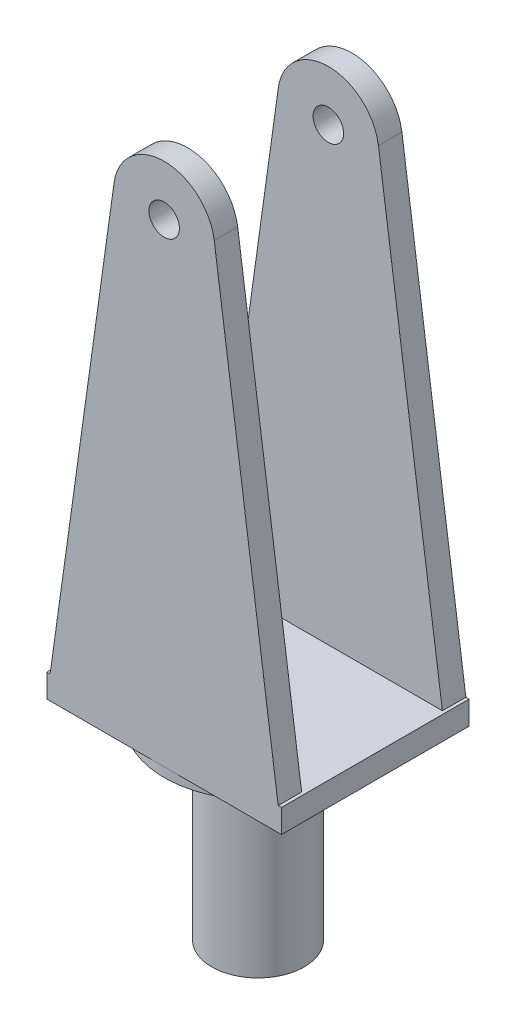
ISO-10303-21;
HEADER;
FILE_DESCRIPTION(('STEP AP214'),'2;1');
FILE_NAME('part.step','',(''),(''),'','','');
FILE_SCHEMA(('AUTOMOTIVE_DESIGN { 1 0 10303 214 1 1 1 1 }'));
ENDSEC;
DATA;
#1=APPLICATION_CONTEXT('core data for automotive mechanical design processes');
#2=APPLICATION_PROTOCOL_DEFINITION('international standard','automotive_design',2000,#1);
#3=PRODUCT_CONTEXT('',#1,'mechanical');
#4=PRODUCT('Part','Part','',(#3));
#5=PRODUCT_RELATED_PRODUCT_CATEGORY('part','',(#4));
#6=PRODUCT_DEFINITION_FORMATION('','',#4);
#7=PRODUCT_DEFINITION_CONTEXT('part definition',#1,'design');
#8=PRODUCT_DEFINITION('design','',#6,#7);
#9=PRODUCT_DEFINITION_SHAPE('','',#8);
#10=(LENGTH_UNIT() NAMED_UNIT(*) SI_UNIT(.MILLI.,.METRE.));
#11=(NAMED_UNIT(*) PLANE_ANGLE_UNIT() SI_UNIT($,.RADIAN.));
#12=(NAMED_UNIT(*) SI_UNIT($,.STERADIAN.) SOLID_ANGLE_UNIT());
#13=UNCERTAINTY_MEASURE_WITH_UNIT(LENGTH_MEASURE(1.E-05),#10,'distance_accuracy_value','');
#14=(GEOMETRIC_REPRESENTATION_CONTEXT(3) GLOBAL_UNCERTAINTY_ASSIGNED_CONTEXT((#13)) GLOBAL_UNIT_ASSIGNED_CONTEXT((#10,
#11,#12)) REPRESENTATION_CONTEXT('',''));
#15=CARTESIAN_POINT('',(0.,0.,0.));
#16=DIRECTION('',(0.,0.,1.));
#17=DIRECTION('',(1.,0.,0.));
#18=AXIS2_PLACEMENT_3D('',#15,#16,#17);
#19=CARTESIAN_POINT('',(0.,2.5,0.));
#20=DIRECTION('',(0.,-1.,0.));
#21=DIRECTION('',(0.,0.,-1.));
#22=AXIS2_PLACEMENT_3D('',#19,#20,#21);
#23=PLANE('',#22);
#24=DIRECTION('',(0.,0.,1.));
#25=VECTOR('',#24,1.);
#26=CARTESIAN_POINT('',(-12.1504525190039,2.5,7.5));
#27=LINE('',#26,#25);
#28=CARTESIAN_POINT('',(-12.1504525190039,2.5,7.5));
#29=VERTEX_POINT('',#28);
#30=CARTESIAN_POINT('',(-12.1504525190039,2.5,10.));
#31=VERTEX_POINT('',#30);
#32=EDGE_CURVE('E59',#29,#31,#27,.T.);
#33=ORIENTED_EDGE('',*,*,#32,.F.);
#34=DIRECTION('',(1.,0.,0.));
#35=VECTOR('',#34,1.);
#36=CARTESIAN_POINT('',(0.,2.5,7.5));
#37=LINE('',#36,#35);
#38=CARTESIAN_POINT('',(12.1504525190039,2.5,7.5));
#39=VERTEX_POINT('',#38);
#40=EDGE_CURVE('E64',#29,#39,#37,.T.);
#41=ORIENTED_EDGE('',*,*,#40,.T.);
#42=DIRECTION('',(0.,0.,1.));
#43=VECTOR('',#42,1.);
#44=CARTESIAN_POINT('',(12.1504525190039,2.5,7.5));
#45=LINE('',#44,#43);
#46=CARTESIAN_POINT('',(12.1504525190039,2.5,10.));
#47=VERTEX_POINT('',#46);
#48=EDGE_CURVE('E159',#39,#47,#45,.T.);
#49=ORIENTED_EDGE('',*,*,#48,.T.);
#50=DIRECTION('',(1.,0.,0.));
#51=VECTOR('',#50,1.);
#52=CARTESIAN_POINT('',(-12.5,2.5,10.));
#53=LINE('',#52,#51);
#54=CARTESIAN_POINT('',(12.5,2.5,10.));
#55=VERTEX_POINT('',#54);
#56=EDGE_CURVE('E263',#47,#55,#53,.T.);
#57=ORIENTED_EDGE('',*,*,#56,.T.);
#58=DIRECTION('',(0.,0.,-1.));
#59=VECTOR('',#58,1.);
#60=CARTESIAN_POINT('',(12.5,2.5,10.));
#61=LINE('',#60,#59);
#62=CARTESIAN_POINT('',(12.5,2.5,-10.));
#63=VERTEX_POINT('',#62);
#64=EDGE_CURVE('E250',#55,#63,#61,.T.);
#65=ORIENTED_EDGE('',*,*,#64,.T.);
#66=DIRECTION('',(-1.,0.,0.));
#67=VECTOR('',#66,1.);
#68=CARTESIAN_POINT('',(-12.5,2.5,-10.));
#69=LINE('',#68,#67);
#70=CARTESIAN_POINT('',(12.1504525190039,2.5,-10.));
#71=VERTEX_POINT('',#70);
#72=EDGE_CURVE('E256',#63,#71,#69,.T.);
#73=ORIENTED_EDGE('',*,*,#72,.T.);
#74=DIRECTION('',(0.,0.,-1.));
#75=VECTOR('',#74,1.);
#76=CARTESIAN_POINT('',(12.1504525190039,2.5,-7.5));
#77=LINE('',#76,#75);
#78=CARTESIAN_POINT('',(12.1504525190039,2.5,-7.5));
#79=VERTEX_POINT('',#78);
#80=EDGE_CURVE('E229',#79,#71,#77,.T.);
#81=ORIENTED_EDGE('',*,*,#80,.F.);
#82=DIRECTION('',(1.,0.,0.));
#83=VECTOR('',#82,1.);
#84=CARTESIAN_POINT('',(0.,2.5,-7.5));
#85=LINE('',#84,#83);
#86=CARTESIAN_POINT('',(-12.1504525190039,2.5,-7.5));
#87=VERTEX_POINT('',#86);
#88=EDGE_CURVE('E205',#87,#79,#85,.T.);
#89=ORIENTED_EDGE('',*,*,#88,.F.);
#90=DIRECTION('',(0.,0.,-1.));
#91=VECTOR('',#90,1.);
#92=CARTESIAN_POINT('',(-12.1504525190039,2.5,-7.5));
#93=LINE('',#92,#91);
#94=CARTESIAN_POINT('',(-12.1504525190039,2.5,-10.));
#95=VERTEX_POINT('',#94);
#96=EDGE_CURVE('E224',#87,#95,#93,.T.);
#97=ORIENTED_EDGE('',*,*,#96,.T.);
#98=CARTESIAN_POINT('',(-12.5,2.5,-10.));
#99=VERTEX_POINT('',#98);
#100=EDGE_CURVE('E254',#95,#99,#69,.T.);
#101=ORIENTED_EDGE('',*,*,#100,.T.);
#102=DIRECTION('',(0.,0.,1.));
#103=VECTOR('',#102,1.);
#104=CARTESIAN_POINT('',(-12.5,2.5,10.));
#105=LINE('',#104,#103);
#106=CARTESIAN_POINT('',(-12.5,2.5,10.));
#107=VERTEX_POINT('',#106);
#108=EDGE_CURVE('E260',#99,#107,#105,.T.);
#109=ORIENTED_EDGE('',*,*,#108,.T.);
#110=EDGE_CURVE('E264',#107,#31,#53,.T.);
#111=ORIENTED_EDGE('',*,*,#110,.T.);
#112=EDGE_LOOP('',(#33,#41,#49,#57,#65,#73,#81,#89,#97,#101,#109,#111));
#113=FACE_BOUND('',#112,.T.);
#114=ADVANCED_FACE('F41',(#113),#23,.F.);
#115=CARTESIAN_POINT('',(0.,0.,0.));
#116=DIRECTION('',(0.,-1.,0.));
#117=DIRECTION('',(0.,0.,-1.));
#118=AXIS2_PLACEMENT_3D('',#115,#116,#117);
#119=PLANE('',#118);
#120=CARTESIAN_POINT('',(0.,0.,0.));
#121=DIRECTION('',(0.,-1.,0.));
#122=DIRECTION('',(0.,0.,-1.));
#123=AXIS2_PLACEMENT_3D('',#120,#121,#122);
#124=CIRCLE('',#123,10.);
#125=CARTESIAN_POINT('',(0.,0.,-10.));
#126=VERTEX_POINT('',#125);
#127=CARTESIAN_POINT('',(0.,0.,10.));
#128=VERTEX_POINT('',#127);
#129=EDGE_CURVE('E240',#126,#128,#124,.T.);
#130=ORIENTED_EDGE('',*,*,#129,.F.);
#131=DIRECTION('',(-1.,0.,0.));
#132=VECTOR('',#131,1.);
#133=CARTESIAN_POINT('',(-12.5,0.,-10.));
#134=LINE('',#133,#132);
#135=CARTESIAN_POINT('',(12.5,0.,-10.));
#136=VERTEX_POINT('',#135);
#137=EDGE_CURVE('E272',#136,#126,#134,.T.);
#138=ORIENTED_EDGE('',*,*,#137,.F.);
#139=DIRECTION('',(0.,0.,-1.));
#140=VECTOR('',#139,1.);
#141=CARTESIAN_POINT('',(12.5,0.,10.));
#142=LINE('',#141,#140);
#143=CARTESIAN_POINT('',(12.5,0.,10.));
#144=VERTEX_POINT('',#143);
#145=EDGE_CURVE('E246',#144,#136,#142,.T.);
#146=ORIENTED_EDGE('',*,*,#145,.F.);
#147=DIRECTION('',(1.,0.,0.));
#148=VECTOR('',#147,1.);
#149=CARTESIAN_POINT('',(-12.5,0.,10.));
#150=LINE('',#149,#148);
#151=EDGE_CURVE('E278',#128,#144,#150,.T.);
#152=ORIENTED_EDGE('',*,*,#151,.F.);
#153=EDGE_LOOP('',(#130,#138,#146,#152));
#154=FACE_BOUND('',#153,.T.);
#155=ADVANCED_FACE('F311',(#154),#119,.T.);
#156=CARTESIAN_POINT('',(12.5,2.5,10.));
#157=DIRECTION('',(-1.,0.,0.));
#158=DIRECTION('',(0.,0.,1.));
#159=AXIS2_PLACEMENT_3D('',#156,#157,#158);
#160=PLANE('',#159);
#161=ORIENTED_EDGE('',*,*,#145,.T.);
#162=DIRECTION('',(0.,-1.,0.));
#163=VECTOR('',#162,1.);
#164=CARTESIAN_POINT('',(12.5,2.5,-10.));
#165=LINE('',#164,#163);
#166=EDGE_CURVE('E45',#63,#136,#165,.T.);
#167=ORIENTED_EDGE('',*,*,#166,.F.);
#168=ORIENTED_EDGE('',*,*,#64,.F.);
#169=DIRECTION('',(0.,-1.,0.));
#170=VECTOR('',#169,1.);
#171=CARTESIAN_POINT('',(12.5,2.5,10.));
#172=LINE('',#171,#170);
#173=EDGE_CURVE('E267',#55,#144,#172,.T.);
#174=ORIENTED_EDGE('',*,*,#173,.T.);
#175=EDGE_LOOP('',(#161,#167,#168,#174));
#176=FACE_BOUND('',#175,.T.);
#177=ADVANCED_FACE('F43',(#176),#160,.F.);
#178=CARTESIAN_POINT('',(-12.5,2.5,-10.));
#179=DIRECTION('',(0.,0.,1.));
#180=DIRECTION('',(1.,0.,0.));
#181=AXIS2_PLACEMENT_3D('',#178,#179,#180);
#182=PLANE('',#181);
#183=ORIENTED_EDGE('',*,*,#137,.T.);
#184=CARTESIAN_POINT('',(-12.5,0.,-10.));
#185=VERTEX_POINT('',#184);
#186=EDGE_CURVE('E271',#126,#185,#134,.T.);
#187=ORIENTED_EDGE('',*,*,#186,.T.);
#188=DIRECTION('',(0.,-1.,0.));
#189=VECTOR('',#188,1.);
#190=CARTESIAN_POINT('',(-12.5,2.5,-10.));
#191=LINE('',#190,#189);
#192=EDGE_CURVE('E288',#99,#185,#191,.T.);
#193=ORIENTED_EDGE('',*,*,#192,.F.);
#194=ORIENTED_EDGE('',*,*,#100,.F.);
#195=DIRECTION('',(0.138472024541617,0.990366345560745,0.));
#196=VECTOR('',#195,1.);
#197=CARTESIAN_POINT('',(-12.2603187302418,1.71422541134599,-10.));
#198=LINE('',#197,#196);
#199=CARTESIAN_POINT('',(-5.33492053085576,51.245394822519,-10.));
#200=VERTEX_POINT('',#199);
#201=EDGE_CURVE('E213',#95,#200,#198,.T.);
#202=ORIENTED_EDGE('',*,*,#201,.T.);
#203=CARTESIAN_POINT('',(0.,50.5,-10.));
#204=DIRECTION('',(0.,0.,-1.));
#205=DIRECTION('',(-1.,0.,0.));
#206=AXIS2_PLACEMENT_3D('',#203,#204,#205);
#207=CIRCLE('',#206,5.38674210557592);
#208=CARTESIAN_POINT('',(5.33492053085576,51.245394822519,-10.));
#209=VERTEX_POINT('',#208);
#210=EDGE_CURVE('E217',#200,#209,#207,.T.);
#211=ORIENTED_EDGE('',*,*,#210,.T.);
#212=DIRECTION('',(-0.138472024541617,0.990366345560745,0.));
#213=VECTOR('',#212,1.);
#214=CARTESIAN_POINT('',(12.2603187302418,1.71422541134599,-10.));
#215=LINE('',#214,#213);
#216=EDGE_CURVE('E194',#71,#209,#215,.T.);
#217=ORIENTED_EDGE('',*,*,#216,.F.);
#218=ORIENTED_EDGE('',*,*,#72,.F.);
#219=ORIENTED_EDGE('',*,*,#166,.T.);
#220=EDGE_LOOP('',(#183,#187,#193,#194,#202,#211,#217,#218,#219));
#221=FACE_BOUND('',#220,.T.);
#222=CARTESIAN_POINT('',(0.,50.5,-10.));
#223=DIRECTION('',(0.,0.,-1.));
#224=DIRECTION('',(-1.,0.,0.));
#225=AXIS2_PLACEMENT_3D('',#222,#223,#224);
#226=CIRCLE('',#225,1.62700000012827);
#227=CARTESIAN_POINT('',(-1.62700000012827,50.5,-10.));
#228=VERTEX_POINT('',#227);
#229=EDGE_CURVE('E183',#228,#228,#226,.T.);
#230=ORIENTED_EDGE('',*,*,#229,.F.);
#231=EDGE_LOOP('',(#230));
#232=FACE_BOUND('',#231,.T.);
#233=ADVANCED_FACE('F324',(#221,#232),#182,.F.);
#234=CARTESIAN_POINT('',(-12.5,2.5,10.));
#235=DIRECTION('',(1.,0.,0.));
#236=DIRECTION('',(0.,0.,-1.));
#237=AXIS2_PLACEMENT_3D('',#234,#235,#236);
#238=PLANE('',#237);
#239=DIRECTION('',(0.,0.,1.));
#240=VECTOR('',#239,1.);
#241=CARTESIAN_POINT('',(-12.5,0.,10.));
#242=LINE('',#241,#240);
#243=CARTESIAN_POINT('',(-12.5,0.,10.));
#244=VERTEX_POINT('',#243);
#245=EDGE_CURVE('E275',#185,#244,#242,.T.);
#246=ORIENTED_EDGE('',*,*,#245,.T.);
#247=DIRECTION('',(0.,-1.,0.));
#248=VECTOR('',#247,1.);
#249=CARTESIAN_POINT('',(-12.5,2.5,10.));
#250=LINE('',#249,#248);
#251=EDGE_CURVE('E285',#107,#244,#250,.T.);
#252=ORIENTED_EDGE('',*,*,#251,.F.);
#253=ORIENTED_EDGE('',*,*,#108,.F.);
#254=ORIENTED_EDGE('',*,*,#192,.T.);
#255=EDGE_LOOP('',(#246,#252,#253,#254));
#256=FACE_BOUND('',#255,.T.);
#257=ADVANCED_FACE('F320',(#256),#238,.F.);
#258=CARTESIAN_POINT('',(-12.5,2.5,10.));
#259=DIRECTION('',(0.,0.,-1.));
#260=DIRECTION('',(-1.,0.,0.));
#261=AXIS2_PLACEMENT_3D('',#258,#259,#260);
#262=PLANE('',#261);
#263=EDGE_CURVE('E255',#244,#128,#150,.T.);
#264=ORIENTED_EDGE('',*,*,#263,.T.);
#265=ORIENTED_EDGE('',*,*,#151,.T.);
#266=ORIENTED_EDGE('',*,*,#173,.F.);
#267=ORIENTED_EDGE('',*,*,#56,.F.);
#268=DIRECTION('',(-0.138472024541617,0.990366345560745,0.));
#269=VECTOR('',#268,1.);
#270=CARTESIAN_POINT('',(12.2603187302418,1.71422541134599,10.));
#271=LINE('',#270,#269);
#272=CARTESIAN_POINT('',(5.33492053085576,51.245394822519,10.));
#273=VERTEX_POINT('',#272);
#274=EDGE_CURVE('E176',#47,#273,#271,.T.);
#275=ORIENTED_EDGE('',*,*,#274,.T.);
#276=CARTESIAN_POINT('',(0.,50.5,10.));
#277=DIRECTION('',(0.,0.,-1.));
#278=DIRECTION('',(-1.,0.,0.));
#279=AXIS2_PLACEMENT_3D('',#276,#277,#278);
#280=CIRCLE('',#279,5.38674210557592);
#281=CARTESIAN_POINT('',(-5.33492053085576,51.245394822519,10.));
#282=VERTEX_POINT('',#281);
#283=EDGE_CURVE('E153',#282,#273,#280,.T.);
#284=ORIENTED_EDGE('',*,*,#283,.F.);
#285=DIRECTION('',(0.138472024541617,0.990366345560745,0.));
#286=VECTOR('',#285,1.);
#287=CARTESIAN_POINT('',(-12.2603187302418,1.71422541134599,10.));
#288=LINE('',#287,#286);
#289=EDGE_CURVE('E172',#31,#282,#288,.T.);
#290=ORIENTED_EDGE('',*,*,#289,.F.);
#291=ORIENTED_EDGE('',*,*,#110,.F.);
#292=ORIENTED_EDGE('',*,*,#251,.T.);
#293=EDGE_LOOP('',(#264,#265,#266,#267,#275,#284,#290,#291,#292));
#294=FACE_BOUND('',#293,.T.);
#295=CARTESIAN_POINT('',(0.,50.5,10.));
#296=DIRECTION('',(0.,0.,-1.));
#297=DIRECTION('',(-1.,0.,0.));
#298=AXIS2_PLACEMENT_3D('',#295,#296,#297);
#299=CIRCLE('',#298,1.62700000012827);
#300=CARTESIAN_POINT('',(-1.62700000012827,50.5,10.));
#301=VERTEX_POINT('',#300);
#302=EDGE_CURVE('E168',#301,#301,#299,.T.);
#303=ORIENTED_EDGE('',*,*,#302,.T.);
#304=EDGE_LOOP('',(#303));
#305=FACE_BOUND('',#304,.T.);
#306=ADVANCED_FACE('F315',(#294,#305),#262,.F.);
#307=EDGE_CURVE('E51',#128,#126,#124,.T.);
#308=ORIENTED_EDGE('',*,*,#307,.F.);
#309=ORIENTED_EDGE('',*,*,#263,.F.);
#310=ORIENTED_EDGE('',*,*,#245,.F.);
#311=ORIENTED_EDGE('',*,*,#186,.F.);
#312=EDGE_LOOP('',(#308,#309,#310,#311));
#313=FACE_BOUND('',#312,.T.);
#314=ADVANCED_FACE('F308',(#313),#119,.T.);
#315=CARTESIAN_POINT('',(0.,-1.,0.));
#316=DIRECTION('',(0.,1.,0.));
#317=DIRECTION('',(0.,0.,1.));
#318=AXIS2_PLACEMENT_3D('',#315,#316,#317);
#319=CYLINDRICAL_SURFACE('',#318,10.);
#320=CARTESIAN_POINT('',(0.,-1.,0.));
#321=DIRECTION('',(0.,-1.,0.));
#322=DIRECTION('',(0.,0.,-1.));
#323=AXIS2_PLACEMENT_3D('',#320,#321,#322);
#324=CIRCLE('',#323,10.);
#325=CARTESIAN_POINT('',(0.,-1.,-10.));
#326=VERTEX_POINT('',#325);
#327=EDGE_CURVE('E242',#326,#326,#324,.T.);
#328=ORIENTED_EDGE('',*,*,#327,.F.);
#329=EDGE_LOOP('',(#328));
#330=FACE_BOUND('',#329,.T.);
#331=ORIENTED_EDGE('',*,*,#129,.T.);
#332=ORIENTED_EDGE('',*,*,#307,.T.);
#333=EDGE_LOOP('',(#331,#332));
#334=FACE_BOUND('',#333,.T.);
#335=ADVANCED_FACE('F302',(#330,#334),#319,.T.);
#336=CARTESIAN_POINT('',(0.,-1.,0.));
#337=DIRECTION('',(0.,-1.,0.));
#338=DIRECTION('',(0.,0.,-1.));
#339=AXIS2_PLACEMENT_3D('',#336,#337,#338);
#340=PLANE('',#339);
#341=CARTESIAN_POINT('',(0.,-1.,0.));
#342=DIRECTION('',(0.,-1.,0.));
#343=DIRECTION('',(0.,0.,-1.));
#344=AXIS2_PLACEMENT_3D('',#341,#342,#343);
#345=CIRCLE('',#344,4.9365);
#346=CARTESIAN_POINT('',(0.,-1.,-4.9365));
#347=VERTEX_POINT('',#346);
#348=EDGE_CURVE('E11',#347,#347,#345,.T.);
#349=ORIENTED_EDGE('',*,*,#348,.F.);
#350=EDGE_LOOP('',(#349));
#351=FACE_BOUND('',#350,.T.);
#352=ORIENTED_EDGE('',*,*,#327,.T.);
#353=EDGE_LOOP('',(#352));
#354=FACE_BOUND('',#353,.T.);
#355=ADVANCED_FACE('F367',(#351,#354),#340,.T.);
#356=CARTESIAN_POINT('',(0.,-21.,0.));
#357=DIRECTION('',(0.,1.,0.));
#358=DIRECTION('',(0.,0.,1.));
#359=AXIS2_PLACEMENT_3D('',#356,#357,#358);
#360=CYLINDRICAL_SURFACE('',#359,4.9365);
#361=CARTESIAN_POINT('',(0.,-21.,0.));
#362=DIRECTION('',(0.,-1.,0.));
#363=DIRECTION('',(0.,0.,-1.));
#364=AXIS2_PLACEMENT_3D('',#361,#362,#363);
#365=CIRCLE('',#364,4.9365);
#366=CARTESIAN_POINT('',(0.,-21.,-4.9365));
#367=VERTEX_POINT('',#366);
#368=EDGE_CURVE('E228',#367,#367,#365,.T.);
#369=ORIENTED_EDGE('',*,*,#368,.F.);
#370=EDGE_LOOP('',(#369));
#371=FACE_BOUND('',#370,.T.);
#372=ORIENTED_EDGE('',*,*,#348,.T.);
#373=EDGE_LOOP('',(#372));
#374=FACE_BOUND('',#373,.T.);
#375=ADVANCED_FACE('F374',(#371,#374),#360,.T.);
#376=CARTESIAN_POINT('',(0.,-21.,0.));
#377=DIRECTION('',(0.,-1.,0.));
#378=DIRECTION('',(0.,0.,-1.));
#379=AXIS2_PLACEMENT_3D('',#376,#377,#378);
#380=PLANE('',#379);
#381=ORIENTED_EDGE('',*,*,#368,.T.);
#382=EDGE_LOOP('',(#381));
#383=FACE_BOUND('',#382,.T.);
#384=ADVANCED_FACE('F381',(#383),#380,.T.);
#385=CARTESIAN_POINT('',(-12.2603187302418,1.71422541134599,-7.5));
#386=DIRECTION('',(-0.990366345560745,0.138472024541617,0.));
#387=DIRECTION('',(-0.138472024541617,-0.990366345560745,0.));
#388=AXIS2_PLACEMENT_3D('',#385,#386,#387);
#389=PLANE('',#388);
#390=ORIENTED_EDGE('',*,*,#201,.F.);
#391=ORIENTED_EDGE('',*,*,#96,.F.);
#392=DIRECTION('',(0.138472024541617,0.990366345560745,0.));
#393=VECTOR('',#392,1.);
#394=CARTESIAN_POINT('',(-12.2603187302418,1.71422541134599,-7.5));
#395=LINE('',#394,#393);
#396=CARTESIAN_POINT('',(-5.33492053085576,51.245394822519,-7.5));
#397=VERTEX_POINT('',#396);
#398=EDGE_CURVE('E193',#87,#397,#395,.T.);
#399=ORIENTED_EDGE('',*,*,#398,.T.);
#400=DIRECTION('',(0.,0.,-1.));
#401=VECTOR('',#400,1.);
#402=CARTESIAN_POINT('',(-5.33492053085576,51.245394822519,-7.5));
#403=LINE('',#402,#401);
#404=EDGE_CURVE('E209',#397,#200,#403,.T.);
#405=ORIENTED_EDGE('',*,*,#404,.T.);
#406=EDGE_LOOP('',(#390,#391,#399,#405));
#407=FACE_BOUND('',#406,.T.);
#408=ADVANCED_FACE('F389',(#407),#389,.T.);
#409=CARTESIAN_POINT('',(12.2603187302418,1.71422541134599,-7.5));
#410=DIRECTION('',(-0.990366345560745,-0.138472024541617,0.));
#411=DIRECTION('',(0.138472024541617,-0.990366345560745,0.));
#412=AXIS2_PLACEMENT_3D('',#409,#410,#411);
#413=PLANE('',#412);
#414=ORIENTED_EDGE('',*,*,#216,.T.);
#415=DIRECTION('',(0.,0.,-1.));
#416=VECTOR('',#415,1.);
#417=CARTESIAN_POINT('',(5.33492053085576,51.245394822519,-7.5));
#418=LINE('',#417,#416);
#419=CARTESIAN_POINT('',(5.33492053085576,51.245394822519,-7.5));
#420=VERTEX_POINT('',#419);
#421=EDGE_CURVE('E233',#420,#209,#418,.T.);
#422=ORIENTED_EDGE('',*,*,#421,.F.);
#423=DIRECTION('',(-0.138472024541617,0.990366345560745,0.));
#424=VECTOR('',#423,1.);
#425=CARTESIAN_POINT('',(12.2603187302418,1.71422541134599,-7.5));
#426=LINE('',#425,#424);
#427=EDGE_CURVE('E202',#79,#420,#426,.T.);
#428=ORIENTED_EDGE('',*,*,#427,.F.);
#429=ORIENTED_EDGE('',*,*,#80,.T.);
#430=EDGE_LOOP('',(#414,#422,#428,#429));
#431=FACE_BOUND('',#430,.T.);
#432=ADVANCED_FACE('F397',(#431),#413,.F.);
#433=CARTESIAN_POINT('',(0.,50.5,-7.5));
#434=DIRECTION('',(0.,0.,-1.));
#435=DIRECTION('',(-1.,0.,0.));
#436=AXIS2_PLACEMENT_3D('',#433,#434,#435);
#437=CYLINDRICAL_SURFACE('',#436,1.62700000012827);
#438=CARTESIAN_POINT('',(0.,50.5,-7.5));
#439=DIRECTION('',(0.,0.,-1.));
#440=DIRECTION('',(-1.,0.,0.));
#441=AXIS2_PLACEMENT_3D('',#438,#439,#440);
#442=CIRCLE('',#441,1.62700000012827);
#443=CARTESIAN_POINT('',(-1.62700000012827,50.5,-7.5));
#444=VERTEX_POINT('',#443);
#445=EDGE_CURVE('E189',#444,#444,#442,.T.);
#446=ORIENTED_EDGE('',*,*,#445,.F.);
#447=EDGE_LOOP('',(#446));
#448=FACE_BOUND('',#447,.T.);
#449=ORIENTED_EDGE('',*,*,#229,.T.);
#450=EDGE_LOOP('',(#449));
#451=FACE_BOUND('',#450,.T.);
#452=ADVANCED_FACE('F405',(#448,#451),#437,.F.);
#453=CARTESIAN_POINT('',(0.,50.5,-7.5));
#454=DIRECTION('',(0.,0.,-1.));
#455=DIRECTION('',(-1.,0.,0.));
#456=AXIS2_PLACEMENT_3D('',#453,#454,#455);
#457=CYLINDRICAL_SURFACE('',#456,5.38674210557592);
#458=ORIENTED_EDGE('',*,*,#210,.F.);
#459=ORIENTED_EDGE('',*,*,#404,.F.);
#460=CARTESIAN_POINT('',(0.,50.5,-7.5));
#461=DIRECTION('',(0.,0.,-1.));
#462=DIRECTION('',(-1.,0.,0.));
#463=AXIS2_PLACEMENT_3D('',#460,#461,#462);
#464=CIRCLE('',#463,5.38674210557592);
#465=EDGE_CURVE('E198',#397,#420,#464,.T.);
#466=ORIENTED_EDGE('',*,*,#465,.T.);
#467=ORIENTED_EDGE('',*,*,#421,.T.);
#468=EDGE_LOOP('',(#458,#459,#466,#467));
#469=FACE_BOUND('',#468,.T.);
#470=ADVANCED_FACE('F413',(#469),#457,.T.);
#471=CARTESIAN_POINT('',(0.,0.,-7.5));
#472=DIRECTION('',(0.,0.,-1.));
#473=DIRECTION('',(-1.,0.,0.));
#474=AXIS2_PLACEMENT_3D('',#471,#472,#473);
#475=PLANE('',#474);
#476=ORIENTED_EDGE('',*,*,#445,.T.);
#477=EDGE_LOOP('',(#476));
#478=FACE_BOUND('',#477,.T.);
#479=ORIENTED_EDGE('',*,*,#398,.F.);
#480=ORIENTED_EDGE('',*,*,#88,.T.);
#481=ORIENTED_EDGE('',*,*,#427,.T.);
#482=ORIENTED_EDGE('',*,*,#465,.F.);
#483=EDGE_LOOP('',(#479,#480,#481,#482));
#484=FACE_BOUND('',#483,.T.);
#485=ADVANCED_FACE('F421',(#478,#484),#475,.F.);
#486=CARTESIAN_POINT('',(-12.2603187302418,1.71422541134599,7.5));
#487=DIRECTION('',(0.990366345560745,-0.138472024541617,0.));
#488=DIRECTION('',(0.138472024541617,0.990366345560745,0.));
#489=AXIS2_PLACEMENT_3D('',#486,#487,#488);
#490=PLANE('',#489);
#491=ORIENTED_EDGE('',*,*,#289,.T.);
#492=DIRECTION('',(0.,0.,1.));
#493=VECTOR('',#492,1.);
#494=CARTESIAN_POINT('',(-5.33492053085576,51.245394822519,7.5));
#495=LINE('',#494,#493);
#496=CARTESIAN_POINT('',(-5.33492053085576,51.245394822519,7.5));
#497=VERTEX_POINT('',#496);
#498=EDGE_CURVE('E158',#497,#282,#495,.T.);
#499=ORIENTED_EDGE('',*,*,#498,.F.);
#500=DIRECTION('',(0.138472024541617,0.990366345560745,0.));
#501=VECTOR('',#500,1.);
#502=CARTESIAN_POINT('',(-12.2603187302418,1.71422541134599,7.5));
#503=LINE('',#502,#501);
#504=EDGE_CURVE('E144',#29,#497,#503,.T.);
#505=ORIENTED_EDGE('',*,*,#504,.F.);
#506=ORIENTED_EDGE('',*,*,#32,.T.);
#507=EDGE_LOOP('',(#491,#499,#505,#506));
#508=FACE_BOUND('',#507,.T.);
#509=ADVANCED_FACE('F429',(#508),#490,.F.);
#510=CARTESIAN_POINT('',(0.,50.5,7.5));
#511=DIRECTION('',(0.,0.,1.));
#512=DIRECTION('',(1.,0.,0.));
#513=AXIS2_PLACEMENT_3D('',#510,#511,#512);
#514=CYLINDRICAL_SURFACE('',#513,5.38674210557592);
#515=ORIENTED_EDGE('',*,*,#283,.T.);
#516=DIRECTION('',(0.,0.,1.));
#517=VECTOR('',#516,1.);
#518=CARTESIAN_POINT('',(5.33492053085576,51.245394822519,7.5));
#519=LINE('',#518,#517);
#520=CARTESIAN_POINT('',(5.33492053085576,51.245394822519,7.5));
#521=VERTEX_POINT('',#520);
#522=EDGE_CURVE('E151',#521,#273,#519,.T.);
#523=ORIENTED_EDGE('',*,*,#522,.F.);
#524=CARTESIAN_POINT('',(0.,50.5,7.5));
#525=DIRECTION('',(0.,0.,-1.));
#526=DIRECTION('',(-1.,0.,0.));
#527=AXIS2_PLACEMENT_3D('',#524,#525,#526);
#528=CIRCLE('',#527,5.38674210557592);
#529=EDGE_CURVE('E139',#497,#521,#528,.T.);
#530=ORIENTED_EDGE('',*,*,#529,.F.);
#531=ORIENTED_EDGE('',*,*,#498,.T.);
#532=EDGE_LOOP('',(#515,#523,#530,#531));
#533=FACE_BOUND('',#532,.T.);
#534=ADVANCED_FACE('F152',(#533),#514,.T.);
#535=CARTESIAN_POINT('',(12.2603187302418,1.71422541134599,7.5));
#536=DIRECTION('',(0.990366345560745,0.138472024541617,0.));
#537=DIRECTION('',(-0.138472024541617,0.990366345560745,0.));
#538=AXIS2_PLACEMENT_3D('',#535,#536,#537);
#539=PLANE('',#538);
#540=ORIENTED_EDGE('',*,*,#274,.F.);
#541=ORIENTED_EDGE('',*,*,#48,.F.);
#542=DIRECTION('',(-0.138472024541617,0.990366345560745,0.));
#543=VECTOR('',#542,1.);
#544=CARTESIAN_POINT('',(12.2603187302418,1.71422541134599,7.5));
#545=LINE('',#544,#543);
#546=EDGE_CURVE('E143',#39,#521,#545,.T.);
#547=ORIENTED_EDGE('',*,*,#546,.T.);
#548=ORIENTED_EDGE('',*,*,#522,.T.);
#549=EDGE_LOOP('',(#540,#541,#547,#548));
#550=FACE_BOUND('',#549,.T.);
#551=ADVANCED_FACE('F161',(#550),#539,.T.);
#552=CARTESIAN_POINT('',(0.,50.5,7.5));
#553=DIRECTION('',(0.,0.,1.));
#554=DIRECTION('',(1.,0.,0.));
#555=AXIS2_PLACEMENT_3D('',#552,#553,#554);
#556=CYLINDRICAL_SURFACE('',#555,1.62700000012827);
#557=CARTESIAN_POINT('',(0.,50.5,7.5));
#558=DIRECTION('',(0.,0.,-1.));
#559=DIRECTION('',(-1.,0.,0.));
#560=AXIS2_PLACEMENT_3D('',#557,#558,#559);
#561=CIRCLE('',#560,1.62700000012827);
#562=CARTESIAN_POINT('',(-1.62700000012827,50.5,7.5));
#563=VERTEX_POINT('',#562);
#564=EDGE_CURVE('E181',#563,#563,#561,.T.);
#565=ORIENTED_EDGE('',*,*,#564,.T.);
#566=EDGE_LOOP('',(#565));
#567=FACE_BOUND('',#566,.T.);
#568=ORIENTED_EDGE('',*,*,#302,.F.);
#569=EDGE_LOOP('',(#568));
#570=FACE_BOUND('',#569,.T.);
#571=ADVANCED_FACE('F449',(#567,#570),#556,.F.);
#572=CARTESIAN_POINT('',(0.,0.,7.5));
#573=DIRECTION('',(0.,0.,1.));
#574=DIRECTION('',(-1.,0.,0.));
#575=AXIS2_PLACEMENT_3D('',#572,#573,#574);
#576=PLANE('',#575);
#577=ORIENTED_EDGE('',*,*,#564,.F.);
#578=EDGE_LOOP('',(#577));
#579=FACE_BOUND('',#578,.T.);
#580=ORIENTED_EDGE('',*,*,#504,.T.);
#581=ORIENTED_EDGE('',*,*,#529,.T.);
#582=ORIENTED_EDGE('',*,*,#546,.F.);
#583=ORIENTED_EDGE('',*,*,#40,.F.);
#584=EDGE_LOOP('',(#580,#581,#582,#583));
#585=FACE_BOUND('',#584,.T.);
#586=ADVANCED_FACE('F141',(#579,#585),#576,.F.);
#587=CLOSED_SHELL('',(#114,#155,#177,#233,#257,#306,#314,#335,#355,#375,#384,#408,#432,#452,
#470,#485,#509,#534,#551,#571,#586));
#588=MANIFOLD_SOLID_BREP('B2',#587);
#589=ADVANCED_BREP_SHAPE_REPRESENTATION('',(#18,#588),#14);
#590=SHAPE_DEFINITION_REPRESENTATION(#9,#589);
ENDSEC;
END-ISO-10303-21;
